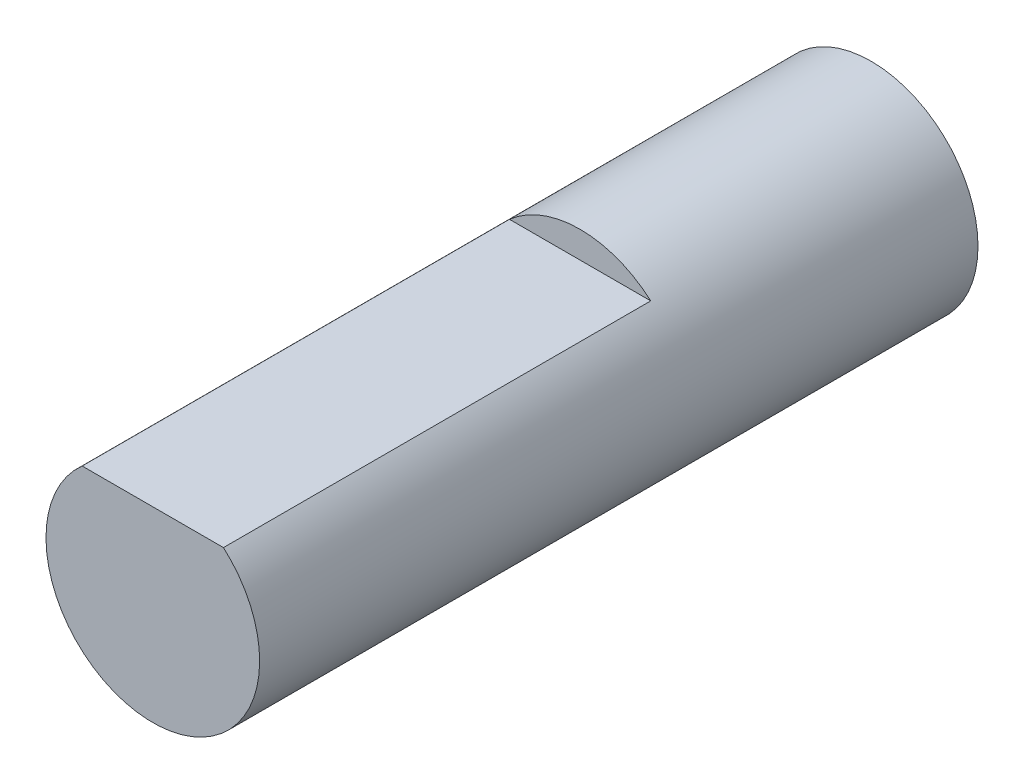
ISO-10303-21;
HEADER;
FILE_DESCRIPTION(('STEP AP214'),'2;1');
FILE_NAME('part.step','',(''),(''),'','','');
FILE_SCHEMA(('AUTOMOTIVE_DESIGN { 1 0 10303 214 1 1 1 1 }'));
ENDSEC;
DATA;
#1=APPLICATION_CONTEXT('core data for automotive mechanical design processes');
#2=APPLICATION_PROTOCOL_DEFINITION('international standard','automotive_design',2000,#1);
#3=PRODUCT_CONTEXT('',#1,'mechanical');
#4=PRODUCT('Part','Part','',(#3));
#5=PRODUCT_RELATED_PRODUCT_CATEGORY('part','',(#4));
#6=PRODUCT_DEFINITION_FORMATION('','',#4);
#7=PRODUCT_DEFINITION_CONTEXT('part definition',#1,'design');
#8=PRODUCT_DEFINITION('design','',#6,#7);
#9=PRODUCT_DEFINITION_SHAPE('','',#8);
#10=(LENGTH_UNIT() NAMED_UNIT(*) SI_UNIT(.MILLI.,.METRE.));
#11=(NAMED_UNIT(*) PLANE_ANGLE_UNIT() SI_UNIT($,.RADIAN.));
#12=(NAMED_UNIT(*) SI_UNIT($,.STERADIAN.) SOLID_ANGLE_UNIT());
#13=UNCERTAINTY_MEASURE_WITH_UNIT(LENGTH_MEASURE(1.E-05),#10,'distance_accuracy_value','');
#14=(GEOMETRIC_REPRESENTATION_CONTEXT(3) GLOBAL_UNCERTAINTY_ASSIGNED_CONTEXT((#13)) GLOBAL_UNIT_ASSIGNED_CONTEXT((#10,
#11,#12)) REPRESENTATION_CONTEXT('',''));
#15=CARTESIAN_POINT('',(0.,0.,0.));
#16=DIRECTION('',(0.,0.,1.));
#17=DIRECTION('',(1.,0.,0.));
#18=AXIS2_PLACEMENT_3D('',#15,#16,#17);
#19=CARTESIAN_POINT('',(0.,0.,4.5));
#20=DIRECTION('',(0.,0.,-1.));
#21=DIRECTION('',(-1.,0.,0.));
#22=AXIS2_PLACEMENT_3D('',#19,#20,#21);
#23=CYLINDRICAL_SURFACE('',#22,2.);
#24=CARTESIAN_POINT('',(0.,0.,4.5));
#25=DIRECTION('',(0.,0.,1.));
#26=DIRECTION('',(1.,0.,0.));
#27=AXIS2_PLACEMENT_3D('',#24,#25,#26);
#28=CIRCLE('',#27,2.);
#29=CARTESIAN_POINT('',(1.3228756555323,1.5,4.5));
#30=VERTEX_POINT('',#29);
#31=CARTESIAN_POINT('',(-1.3228756555323,1.5,4.5));
#32=VERTEX_POINT('',#31);
#33=EDGE_CURVE('E11',#30,#32,#28,.T.);
#34=ORIENTED_EDGE('',*,*,#33,.F.);
#35=DIRECTION('',(0.,0.,-1.));
#36=VECTOR('',#35,1.);
#37=CARTESIAN_POINT('',(1.3228756555323,1.5,12.5));
#38=LINE('',#37,#36);
#39=CARTESIAN_POINT('',(1.3228756555323,1.5,12.5));
#40=VERTEX_POINT('',#39);
#41=EDGE_CURVE('E75',#40,#30,#38,.T.);
#42=ORIENTED_EDGE('',*,*,#41,.F.);
#43=CARTESIAN_POINT('',(0.,0.,12.5));
#44=DIRECTION('',(0.,0.,1.));
#45=DIRECTION('',(-1.,0.,0.));
#46=AXIS2_PLACEMENT_3D('',#43,#44,#45);
#47=CIRCLE('',#46,2.);
#48=CARTESIAN_POINT('',(-1.3228756555323,1.5,12.5));
#49=VERTEX_POINT('',#48);
#50=EDGE_CURVE('E71',#49,#40,#47,.T.);
#51=ORIENTED_EDGE('',*,*,#50,.F.);
#52=DIRECTION('',(0.,0.,-1.));
#53=VECTOR('',#52,1.);
#54=CARTESIAN_POINT('',(-1.3228756555323,1.5,12.5));
#55=LINE('',#54,#53);
#56=EDGE_CURVE('E69',#49,#32,#55,.T.);
#57=ORIENTED_EDGE('',*,*,#56,.T.);
#58=EDGE_LOOP('',(#34,#42,#51,#57));
#59=FACE_BOUND('',#58,.T.);
#60=CARTESIAN_POINT('',(0.,0.,-0.95));
#61=DIRECTION('',(0.,0.,1.));
#62=DIRECTION('',(1.,0.,0.));
#63=AXIS2_PLACEMENT_3D('',#60,#61,#62);
#64=CIRCLE('',#63,2.);
#65=CARTESIAN_POINT('',(2.,0.,-0.95));
#66=VERTEX_POINT('',#65);
#67=EDGE_CURVE('E45',#66,#66,#64,.T.);
#68=ORIENTED_EDGE('',*,*,#67,.T.);
#69=EDGE_LOOP('',(#68));
#70=FACE_BOUND('',#69,.T.);
#71=ADVANCED_FACE('F39',(#59,#70),#23,.T.);
#72=CARTESIAN_POINT('',(0.,0.,4.5));
#73=DIRECTION('',(0.,0.,1.));
#74=DIRECTION('',(1.,0.,0.));
#75=AXIS2_PLACEMENT_3D('',#72,#73,#74);
#76=PLANE('',#75);
#77=DIRECTION('',(-1.,0.,0.));
#78=VECTOR('',#77,1.);
#79=CARTESIAN_POINT('',(-1.3228756555323,1.5,4.5));
#80=LINE('',#79,#78);
#81=EDGE_CURVE('E51',#30,#32,#80,.T.);
#82=ORIENTED_EDGE('',*,*,#81,.F.);
#83=ORIENTED_EDGE('',*,*,#33,.T.);
#84=EDGE_LOOP('',(#82,#83));
#85=FACE_BOUND('',#84,.T.);
#86=ADVANCED_FACE('F65',(#85),#76,.T.);
#87=CARTESIAN_POINT('',(0.,0.,-0.95));
#88=DIRECTION('',(0.,0.,1.));
#89=DIRECTION('',(1.,0.,0.));
#90=AXIS2_PLACEMENT_3D('',#87,#88,#89);
#91=PLANE('',#90);
#92=ORIENTED_EDGE('',*,*,#67,.F.);
#93=EDGE_LOOP('',(#92));
#94=FACE_BOUND('',#93,.T.);
#95=ADVANCED_FACE('F88',(#94),#91,.F.);
#96=CARTESIAN_POINT('',(-1.3228756555323,1.5,12.5));
#97=DIRECTION('',(0.,-1.,0.));
#98=DIRECTION('',(0.,0.,-1.));
#99=AXIS2_PLACEMENT_3D('',#96,#97,#98);
#100=PLANE('',#99);
#101=ORIENTED_EDGE('',*,*,#81,.T.);
#102=ORIENTED_EDGE('',*,*,#56,.F.);
#103=DIRECTION('',(-1.,0.,0.));
#104=VECTOR('',#103,1.);
#105=CARTESIAN_POINT('',(-1.3228756555323,1.5,12.5));
#106=LINE('',#105,#104);
#107=EDGE_CURVE('E56',#40,#49,#106,.T.);
#108=ORIENTED_EDGE('',*,*,#107,.F.);
#109=ORIENTED_EDGE('',*,*,#41,.T.);
#110=EDGE_LOOP('',(#101,#102,#108,#109));
#111=FACE_BOUND('',#110,.T.);
#112=ADVANCED_FACE('F67',(#111),#100,.F.);
#113=CARTESIAN_POINT('',(0.,0.,12.5));
#114=DIRECTION('',(0.,0.,-1.));
#115=DIRECTION('',(-1.,0.,0.));
#116=AXIS2_PLACEMENT_3D('',#113,#114,#115);
#117=PLANE('',#116);
#118=ORIENTED_EDGE('',*,*,#50,.T.);
#119=ORIENTED_EDGE('',*,*,#107,.T.);
#120=EDGE_LOOP('',(#118,#119));
#121=FACE_BOUND('',#120,.T.);
#122=ADVANCED_FACE('F77',(#121),#117,.F.);
#123=CLOSED_SHELL('',(#71,#86,#95,#112,#122));
#124=MANIFOLD_SOLID_BREP('B2',#123);
#125=ADVANCED_BREP_SHAPE_REPRESENTATION('',(#18,#124),#14);
#126=SHAPE_DEFINITION_REPRESENTATION(#9,#125);
ENDSEC;
END-ISO-10303-21;
